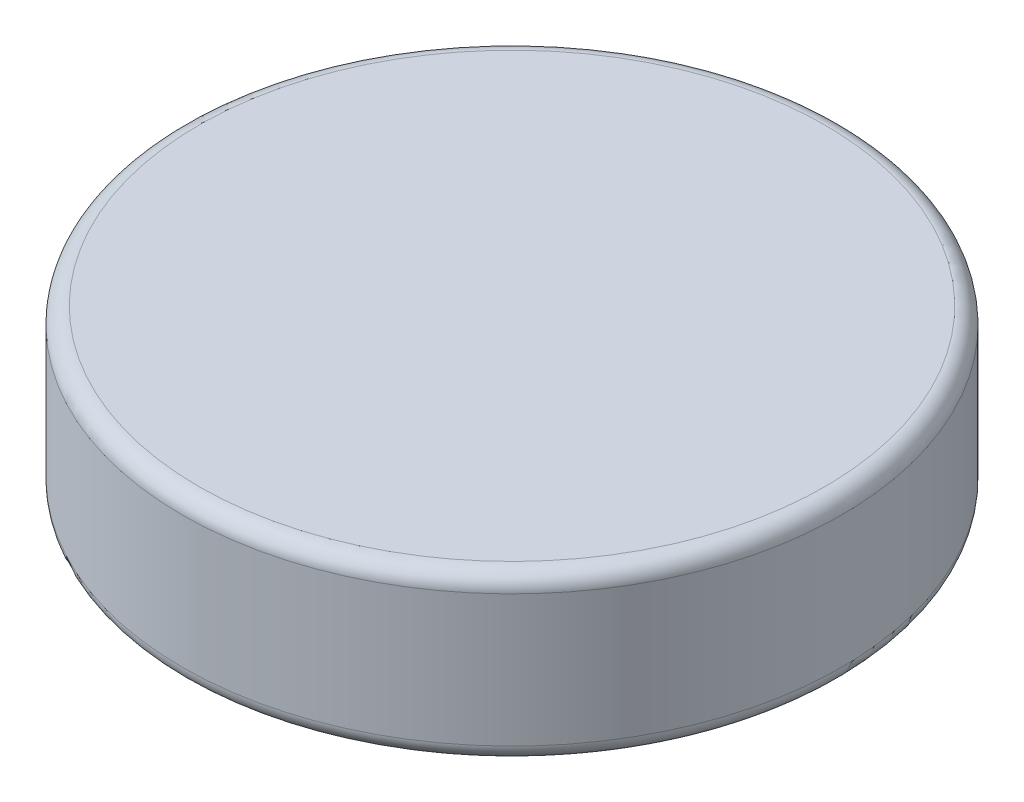
ISO-10303-21;
HEADER;
FILE_DESCRIPTION(('STEP AP214'),'2;1');
FILE_NAME('part.step','',(''),(''),'','','');
FILE_SCHEMA(('AUTOMOTIVE_DESIGN { 1 0 10303 214 1 1 1 1 }'));
ENDSEC;
DATA;
#1=APPLICATION_CONTEXT('core data for automotive mechanical design processes');
#2=APPLICATION_PROTOCOL_DEFINITION('international standard','automotive_design',2000,#1);
#3=PRODUCT_CONTEXT('',#1,'mechanical');
#4=PRODUCT('Part','Part','',(#3));
#5=PRODUCT_RELATED_PRODUCT_CATEGORY('part','',(#4));
#6=PRODUCT_DEFINITION_FORMATION('','',#4);
#7=PRODUCT_DEFINITION_CONTEXT('part definition',#1,'design');
#8=PRODUCT_DEFINITION('design','',#6,#7);
#9=PRODUCT_DEFINITION_SHAPE('','',#8);
#10=(LENGTH_UNIT() NAMED_UNIT(*) SI_UNIT(.MILLI.,.METRE.));
#11=(NAMED_UNIT(*) PLANE_ANGLE_UNIT() SI_UNIT($,.RADIAN.));
#12=(NAMED_UNIT(*) SI_UNIT($,.STERADIAN.) SOLID_ANGLE_UNIT());
#13=UNCERTAINTY_MEASURE_WITH_UNIT(LENGTH_MEASURE(1.E-05),#10,'distance_accuracy_value','');
#14=(GEOMETRIC_REPRESENTATION_CONTEXT(3) GLOBAL_UNCERTAINTY_ASSIGNED_CONTEXT((#13)) GLOBAL_UNIT_ASSIGNED_CONTEXT((#10,
#11,#12)) REPRESENTATION_CONTEXT('',''));
#15=CARTESIAN_POINT('',(0.,0.,0.));
#16=DIRECTION('',(0.,0.,1.));
#17=DIRECTION('',(1.,0.,0.));
#18=AXIS2_PLACEMENT_3D('',#15,#16,#17);
#19=CARTESIAN_POINT('',(0.,1.5875,0.));
#20=DIRECTION('',(0.,-1.,0.));
#21=DIRECTION('',(0.,0.,-1.));
#22=AXIS2_PLACEMENT_3D('',#19,#20,#21);
#23=CYLINDRICAL_SURFACE('',#22,6.35);
#24=CARTESIAN_POINT('',(0.,-1.27,0.));
#25=DIRECTION('',(0.,1.,0.));
#26=DIRECTION('',(0.,0.,1.));
#27=AXIS2_PLACEMENT_3D('',#24,#25,#26);
#28=CIRCLE('',#27,6.35);
#29=CARTESIAN_POINT('',(0.,-1.27,6.35));
#30=VERTEX_POINT('',#29);
#31=EDGE_CURVE('E43',#30,#30,#28,.T.);
#32=ORIENTED_EDGE('',*,*,#31,.T.);
#33=EDGE_LOOP('',(#32));
#34=FACE_BOUND('',#33,.T.);
#35=CARTESIAN_POINT('',(0.,1.27,0.));
#36=DIRECTION('',(0.,1.,0.));
#37=DIRECTION('',(0.,0.,1.));
#38=AXIS2_PLACEMENT_3D('',#35,#36,#37);
#39=CIRCLE('',#38,6.35);
#40=CARTESIAN_POINT('',(0.,1.27,6.35));
#41=VERTEX_POINT('',#40);
#42=EDGE_CURVE('E47',#41,#41,#39,.F.);
#43=ORIENTED_EDGE('',*,*,#42,.T.);
#44=EDGE_LOOP('',(#43));
#45=FACE_BOUND('',#44,.T.);
#46=ADVANCED_FACE('F32',(#34,#45),#23,.T.);
#47=CARTESIAN_POINT('',(0.,1.5875,0.));
#48=DIRECTION('',(0.,1.,0.));
#49=DIRECTION('',(0.,0.,1.));
#50=AXIS2_PLACEMENT_3D('',#47,#48,#49);
#51=PLANE('',#50);
#52=CARTESIAN_POINT('',(0.,1.5875,0.));
#53=DIRECTION('',(0.,1.,0.));
#54=DIRECTION('',(0.,0.,1.));
#55=AXIS2_PLACEMENT_3D('',#52,#53,#54);
#56=CIRCLE('',#55,6.0325);
#57=CARTESIAN_POINT('',(0.,1.5875,6.0325));
#58=VERTEX_POINT('',#57);
#59=EDGE_CURVE('E10',#58,#58,#56,.T.);
#60=ORIENTED_EDGE('',*,*,#59,.T.);
#61=EDGE_LOOP('',(#60));
#62=FACE_BOUND('',#61,.T.);
#63=ADVANCED_FACE('F63',(#62),#51,.T.);
#64=CARTESIAN_POINT('',(0.,-1.5875,0.));
#65=DIRECTION('',(0.,1.,0.));
#66=DIRECTION('',(0.,0.,1.));
#67=AXIS2_PLACEMENT_3D('',#64,#65,#66);
#68=PLANE('',#67);
#69=CARTESIAN_POINT('',(0.,-1.5875,0.));
#70=DIRECTION('',(0.,1.,0.));
#71=DIRECTION('',(0.,0.,1.));
#72=AXIS2_PLACEMENT_3D('',#69,#70,#71);
#73=CIRCLE('',#72,6.0325);
#74=CARTESIAN_POINT('',(0.,-1.5875,6.0325));
#75=VERTEX_POINT('',#74);
#76=EDGE_CURVE('E39',#75,#75,#73,.F.);
#77=ORIENTED_EDGE('',*,*,#76,.T.);
#78=EDGE_LOOP('',(#77));
#79=FACE_BOUND('',#78,.T.);
#80=ADVANCED_FACE('F60',(#79),#68,.F.);
#81=CARTESIAN_POINT('',(0.,-1.27,0.));
#82=DIRECTION('',(0.,1.,0.));
#83=DIRECTION('',(0.,0.,1.));
#84=AXIS2_PLACEMENT_3D('',#81,#82,#83);
#85=TOROIDAL_SURFACE('',#84,6.0325,0.3175);
#86=ORIENTED_EDGE('',*,*,#76,.F.);
#87=EDGE_LOOP('',(#86));
#88=FACE_BOUND('',#87,.T.);
#89=ORIENTED_EDGE('',*,*,#31,.F.);
#90=EDGE_LOOP('',(#89));
#91=FACE_BOUND('',#90,.T.);
#92=ADVANCED_FACE('F56',(#88,#91),#85,.T.);
#93=CARTESIAN_POINT('',(0.,1.27,0.));
#94=DIRECTION('',(0.,1.,0.));
#95=DIRECTION('',(0.,0.,1.));
#96=AXIS2_PLACEMENT_3D('',#93,#94,#95);
#97=TOROIDAL_SURFACE('',#96,6.0325,0.3175);
#98=ORIENTED_EDGE('',*,*,#42,.F.);
#99=EDGE_LOOP('',(#98));
#100=FACE_BOUND('',#99,.T.);
#101=ORIENTED_EDGE('',*,*,#59,.F.);
#102=EDGE_LOOP('',(#101));
#103=FACE_BOUND('',#102,.T.);
#104=ADVANCED_FACE('F34',(#100,#103),#97,.T.);
#105=CLOSED_SHELL('',(#46,#63,#80,#92,#104));
#106=MANIFOLD_SOLID_BREP('B2',#105);
#107=ADVANCED_BREP_SHAPE_REPRESENTATION('',(#18,#106),#14);
#108=SHAPE_DEFINITION_REPRESENTATION(#9,#107);
ENDSEC;
END-ISO-10303-21;
